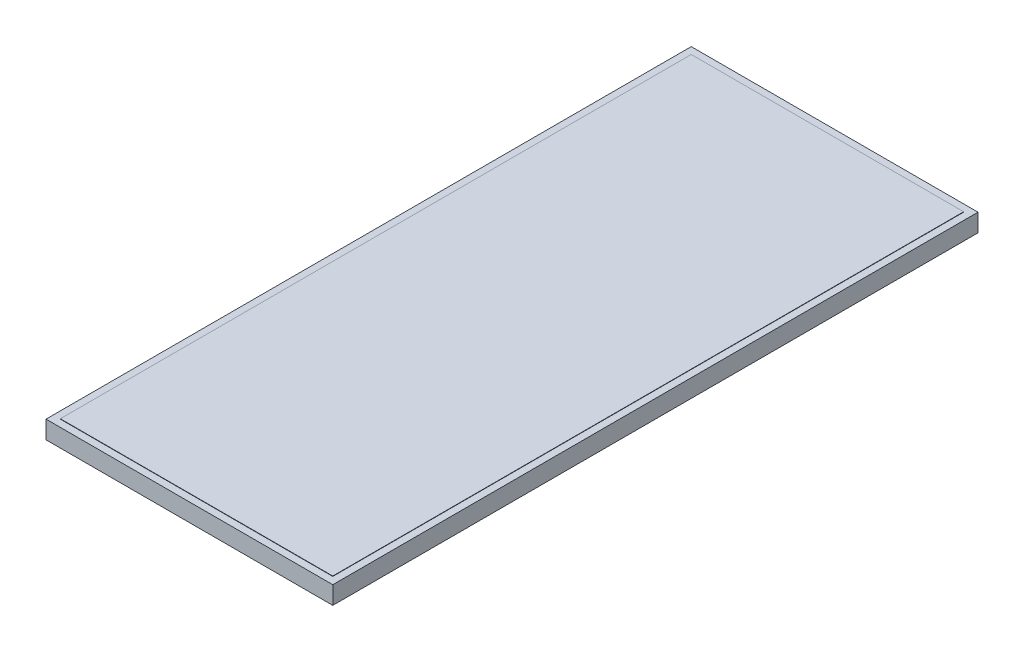
ISO-10303-21;
HEADER;
FILE_DESCRIPTION(('STEP AP214'),'2;1');
FILE_NAME('part.step','',(''),(''),'','','');
FILE_SCHEMA(('AUTOMOTIVE_DESIGN { 1 0 10303 214 1 1 1 1 }'));
ENDSEC;
DATA;
#1=APPLICATION_CONTEXT('core data for automotive mechanical design processes');
#2=APPLICATION_PROTOCOL_DEFINITION('international standard','automotive_design',2000,#1);
#3=PRODUCT_CONTEXT('',#1,'mechanical');
#4=PRODUCT('Part','Part','',(#3));
#5=PRODUCT_RELATED_PRODUCT_CATEGORY('part','',(#4));
#6=PRODUCT_DEFINITION_FORMATION('','',#4);
#7=PRODUCT_DEFINITION_CONTEXT('part definition',#1,'design');
#8=PRODUCT_DEFINITION('design','',#6,#7);
#9=PRODUCT_DEFINITION_SHAPE('','',#8);
#10=(LENGTH_UNIT() NAMED_UNIT(*) SI_UNIT(.MILLI.,.METRE.));
#11=(NAMED_UNIT(*) PLANE_ANGLE_UNIT() SI_UNIT($,.RADIAN.));
#12=(NAMED_UNIT(*) SI_UNIT($,.STERADIAN.) SOLID_ANGLE_UNIT());
#13=UNCERTAINTY_MEASURE_WITH_UNIT(LENGTH_MEASURE(1.E-05),#10,'distance_accuracy_value','');
#14=(GEOMETRIC_REPRESENTATION_CONTEXT(3) GLOBAL_UNCERTAINTY_ASSIGNED_CONTEXT((#13)) GLOBAL_UNIT_ASSIGNED_CONTEXT((#10,
#11,#12)) REPRESENTATION_CONTEXT('',''));
#15=CARTESIAN_POINT('',(0.,0.,0.));
#16=DIRECTION('',(0.,0.,1.));
#17=DIRECTION('',(1.,0.,0.));
#18=AXIS2_PLACEMENT_3D('',#15,#16,#17);
#19=CARTESIAN_POINT('',(0.,50.,0.));
#20=DIRECTION('',(0.,-1.,0.));
#21=DIRECTION('',(0.,0.,-1.));
#22=AXIS2_PLACEMENT_3D('',#19,#20,#21);
#23=PLANE('',#22);
#24=DIRECTION('',(0.,0.,1.));
#25=VECTOR('',#24,1.);
#26=CARTESIAN_POINT('',(0.,50.,0.));
#27=LINE('',#26,#25);
#28=CARTESIAN_POINT('',(0.,50.,-1800.));
#29=VERTEX_POINT('',#28);
#30=CARTESIAN_POINT('',(0.,50.,0.));
#31=VERTEX_POINT('',#30);
#32=EDGE_CURVE('E130',#29,#31,#27,.T.);
#33=ORIENTED_EDGE('',*,*,#32,.T.);
#34=DIRECTION('',(1.,0.,0.));
#35=VECTOR('',#34,1.);
#36=CARTESIAN_POINT('',(0.,50.,0.));
#37=LINE('',#36,#35);
#38=CARTESIAN_POINT('',(800.,50.,0.));
#39=VERTEX_POINT('',#38);
#40=EDGE_CURVE('E133',#31,#39,#37,.T.);
#41=ORIENTED_EDGE('',*,*,#40,.T.);
#42=DIRECTION('',(0.,0.,-1.));
#43=VECTOR('',#42,1.);
#44=CARTESIAN_POINT('',(800.,50.,0.));
#45=LINE('',#44,#43);
#46=CARTESIAN_POINT('',(800.,50.,-1800.));
#47=VERTEX_POINT('',#46);
#48=EDGE_CURVE('E136',#39,#47,#45,.T.);
#49=ORIENTED_EDGE('',*,*,#48,.T.);
#50=DIRECTION('',(-1.,0.,0.));
#51=VECTOR('',#50,1.);
#52=CARTESIAN_POINT('',(0.,50.,-1800.));
#53=LINE('',#52,#51);
#54=EDGE_CURVE('E138',#47,#29,#53,.T.);
#55=ORIENTED_EDGE('',*,*,#54,.T.);
#56=EDGE_LOOP('',(#33,#41,#49,#55));
#57=FACE_BOUND('',#56,.T.);
#58=DIRECTION('',(-1.,0.,0.));
#59=VECTOR('',#58,1.);
#60=CARTESIAN_POINT('',(780.,50.,-1780.));
#61=LINE('',#60,#59);
#62=CARTESIAN_POINT('',(780.,50.,-1780.));
#63=VERTEX_POINT('',#62);
#64=CARTESIAN_POINT('',(20.,50.,-1780.));
#65=VERTEX_POINT('',#64);
#66=EDGE_CURVE('E120',#63,#65,#61,.T.);
#67=ORIENTED_EDGE('',*,*,#66,.F.);
#68=DIRECTION('',(0.,0.,-1.));
#69=VECTOR('',#68,1.);
#70=CARTESIAN_POINT('',(780.,50.,-20.));
#71=LINE('',#70,#69);
#72=CARTESIAN_POINT('',(780.,50.,-20.));
#73=VERTEX_POINT('',#72);
#74=EDGE_CURVE('E117',#73,#63,#71,.T.);
#75=ORIENTED_EDGE('',*,*,#74,.F.);
#76=DIRECTION('',(1.,0.,0.));
#77=VECTOR('',#76,1.);
#78=CARTESIAN_POINT('',(20.,50.,-20.));
#79=LINE('',#78,#77);
#80=CARTESIAN_POINT('',(20.,50.,-20.));
#81=VERTEX_POINT('',#80);
#82=EDGE_CURVE('E55',#81,#73,#79,.T.);
#83=ORIENTED_EDGE('',*,*,#82,.F.);
#84=DIRECTION('',(0.,0.,1.));
#85=VECTOR('',#84,1.);
#86=CARTESIAN_POINT('',(20.,50.,-1780.));
#87=LINE('',#86,#85);
#88=EDGE_CURVE('E50',#65,#81,#87,.T.);
#89=ORIENTED_EDGE('',*,*,#88,.F.);
#90=EDGE_LOOP('',(#67,#75,#83,#89));
#91=FACE_BOUND('',#90,.T.);
#92=ADVANCED_FACE('F35',(#57,#91),#23,.F.);
#93=CARTESIAN_POINT('',(0.,50.,0.));
#94=DIRECTION('',(1.,0.,0.));
#95=DIRECTION('',(0.,0.,-1.));
#96=AXIS2_PLACEMENT_3D('',#93,#94,#95);
#97=PLANE('',#96);
#98=DIRECTION('',(0.,0.,1.));
#99=VECTOR('',#98,1.);
#100=CARTESIAN_POINT('',(0.,0.,0.));
#101=LINE('',#100,#99);
#102=CARTESIAN_POINT('',(0.,0.,-1800.));
#103=VERTEX_POINT('',#102);
#104=CARTESIAN_POINT('',(0.,0.,0.));
#105=VERTEX_POINT('',#104);
#106=EDGE_CURVE('E121',#103,#105,#101,.T.);
#107=ORIENTED_EDGE('',*,*,#106,.T.);
#108=DIRECTION('',(0.,-1.,0.));
#109=VECTOR('',#108,1.);
#110=CARTESIAN_POINT('',(0.,50.,0.));
#111=LINE('',#110,#109);
#112=EDGE_CURVE('E11',#31,#105,#111,.T.);
#113=ORIENTED_EDGE('',*,*,#112,.F.);
#114=ORIENTED_EDGE('',*,*,#32,.F.);
#115=DIRECTION('',(0.,-1.,0.));
#116=VECTOR('',#115,1.);
#117=CARTESIAN_POINT('',(0.,50.,-1800.));
#118=LINE('',#117,#116);
#119=EDGE_CURVE('E139',#29,#103,#118,.T.);
#120=ORIENTED_EDGE('',*,*,#119,.T.);
#121=EDGE_LOOP('',(#107,#113,#114,#120));
#122=FACE_BOUND('',#121,.T.);
#123=ADVANCED_FACE('F37',(#122),#97,.F.);
#124=CARTESIAN_POINT('',(0.,50.,0.));
#125=DIRECTION('',(0.,0.,-1.));
#126=DIRECTION('',(-1.,0.,0.));
#127=AXIS2_PLACEMENT_3D('',#124,#125,#126);
#128=PLANE('',#127);
#129=DIRECTION('',(1.,0.,0.));
#130=VECTOR('',#129,1.);
#131=CARTESIAN_POINT('',(0.,0.,0.));
#132=LINE('',#131,#130);
#133=CARTESIAN_POINT('',(800.,0.,0.));
#134=VERTEX_POINT('',#133);
#135=EDGE_CURVE('E124',#105,#134,#132,.T.);
#136=ORIENTED_EDGE('',*,*,#135,.T.);
#137=DIRECTION('',(0.,-1.,0.));
#138=VECTOR('',#137,1.);
#139=CARTESIAN_POINT('',(800.,50.,0.));
#140=LINE('',#139,#138);
#141=EDGE_CURVE('E43',#39,#134,#140,.T.);
#142=ORIENTED_EDGE('',*,*,#141,.F.);
#143=ORIENTED_EDGE('',*,*,#40,.F.);
#144=ORIENTED_EDGE('',*,*,#112,.T.);
#145=EDGE_LOOP('',(#136,#142,#143,#144));
#146=FACE_BOUND('',#145,.T.);
#147=ADVANCED_FACE('F169',(#146),#128,.F.);
#148=CARTESIAN_POINT('',(800.,50.,0.));
#149=DIRECTION('',(-1.,0.,0.));
#150=DIRECTION('',(0.,0.,1.));
#151=AXIS2_PLACEMENT_3D('',#148,#149,#150);
#152=PLANE('',#151);
#153=DIRECTION('',(0.,0.,-1.));
#154=VECTOR('',#153,1.);
#155=CARTESIAN_POINT('',(800.,0.,0.));
#156=LINE('',#155,#154);
#157=CARTESIAN_POINT('',(800.,0.,-1800.));
#158=VERTEX_POINT('',#157);
#159=EDGE_CURVE('E142',#134,#158,#156,.T.);
#160=ORIENTED_EDGE('',*,*,#159,.T.);
#161=DIRECTION('',(0.,-1.,0.));
#162=VECTOR('',#161,1.);
#163=CARTESIAN_POINT('',(800.,50.,-1800.));
#164=LINE('',#163,#162);
#165=EDGE_CURVE('E147',#47,#158,#164,.T.);
#166=ORIENTED_EDGE('',*,*,#165,.F.);
#167=ORIENTED_EDGE('',*,*,#48,.F.);
#168=ORIENTED_EDGE('',*,*,#141,.T.);
#169=EDGE_LOOP('',(#160,#166,#167,#168));
#170=FACE_BOUND('',#169,.T.);
#171=ADVANCED_FACE('F154',(#170),#152,.F.);
#172=CARTESIAN_POINT('',(0.,50.,-1800.));
#173=DIRECTION('',(0.,0.,1.));
#174=DIRECTION('',(1.,0.,0.));
#175=AXIS2_PLACEMENT_3D('',#172,#173,#174);
#176=PLANE('',#175);
#177=DIRECTION('',(-1.,0.,0.));
#178=VECTOR('',#177,1.);
#179=CARTESIAN_POINT('',(0.,0.,-1800.));
#180=LINE('',#179,#178);
#181=EDGE_CURVE('E134',#158,#103,#180,.T.);
#182=ORIENTED_EDGE('',*,*,#181,.T.);
#183=ORIENTED_EDGE('',*,*,#119,.F.);
#184=ORIENTED_EDGE('',*,*,#54,.F.);
#185=ORIENTED_EDGE('',*,*,#165,.T.);
#186=EDGE_LOOP('',(#182,#183,#184,#185));
#187=FACE_BOUND('',#186,.T.);
#188=ADVANCED_FACE('F163',(#187),#176,.F.);
#189=CARTESIAN_POINT('',(0.,0.,0.));
#190=DIRECTION('',(0.,-1.,0.));
#191=DIRECTION('',(0.,0.,-1.));
#192=AXIS2_PLACEMENT_3D('',#189,#190,#191);
#193=PLANE('',#192);
#194=ORIENTED_EDGE('',*,*,#106,.F.);
#195=ORIENTED_EDGE('',*,*,#181,.F.);
#196=ORIENTED_EDGE('',*,*,#159,.F.);
#197=ORIENTED_EDGE('',*,*,#135,.F.);
#198=EDGE_LOOP('',(#194,#195,#196,#197));
#199=FACE_BOUND('',#198,.T.);
#200=ADVANCED_FACE('F160',(#199),#193,.T.);
#201=CARTESIAN_POINT('',(780.,51.,-1780.));
#202=DIRECTION('',(0.,0.,1.));
#203=DIRECTION('',(1.,0.,0.));
#204=AXIS2_PLACEMENT_3D('',#201,#202,#203);
#205=PLANE('',#204);
#206=ORIENTED_EDGE('',*,*,#66,.T.);
#207=DIRECTION('',(0.,-1.,0.));
#208=VECTOR('',#207,1.);
#209=CARTESIAN_POINT('',(20.,51.,-1780.));
#210=LINE('',#209,#208);
#211=CARTESIAN_POINT('',(20.,51.,-1780.));
#212=VERTEX_POINT('',#211);
#213=EDGE_CURVE('E101',#212,#65,#210,.T.);
#214=ORIENTED_EDGE('',*,*,#213,.F.);
#215=DIRECTION('',(-1.,0.,0.));
#216=VECTOR('',#215,1.);
#217=CARTESIAN_POINT('',(780.,51.,-1780.));
#218=LINE('',#217,#216);
#219=CARTESIAN_POINT('',(780.,51.,-1780.));
#220=VERTEX_POINT('',#219);
#221=EDGE_CURVE('E108',#220,#212,#218,.T.);
#222=ORIENTED_EDGE('',*,*,#221,.F.);
#223=DIRECTION('',(0.,-1.,0.));
#224=VECTOR('',#223,1.);
#225=CARTESIAN_POINT('',(780.,51.,-1780.));
#226=LINE('',#225,#224);
#227=EDGE_CURVE('E254',#220,#63,#226,.T.);
#228=ORIENTED_EDGE('',*,*,#227,.T.);
#229=EDGE_LOOP('',(#206,#214,#222,#228));
#230=FACE_BOUND('',#229,.T.);
#231=ADVANCED_FACE('F119',(#230),#205,.F.);
#232=CARTESIAN_POINT('',(20.,51.,-1780.));
#233=DIRECTION('',(1.,0.,0.));
#234=DIRECTION('',(0.,0.,-1.));
#235=AXIS2_PLACEMENT_3D('',#232,#233,#234);
#236=PLANE('',#235);
#237=ORIENTED_EDGE('',*,*,#88,.T.);
#238=DIRECTION('',(0.,-1.,0.));
#239=VECTOR('',#238,1.);
#240=CARTESIAN_POINT('',(20.,51.,-20.));
#241=LINE('',#240,#239);
#242=CARTESIAN_POINT('',(20.,51.,-20.));
#243=VERTEX_POINT('',#242);
#244=EDGE_CURVE('E104',#243,#81,#241,.T.);
#245=ORIENTED_EDGE('',*,*,#244,.F.);
#246=DIRECTION('',(0.,0.,1.));
#247=VECTOR('',#246,1.);
#248=CARTESIAN_POINT('',(20.,51.,-1780.));
#249=LINE('',#248,#247);
#250=EDGE_CURVE('E97',#212,#243,#249,.T.);
#251=ORIENTED_EDGE('',*,*,#250,.F.);
#252=ORIENTED_EDGE('',*,*,#213,.T.);
#253=EDGE_LOOP('',(#237,#245,#251,#252));
#254=FACE_BOUND('',#253,.T.);
#255=ADVANCED_FACE('F99',(#254),#236,.F.);
#256=CARTESIAN_POINT('',(20.,51.,-20.));
#257=DIRECTION('',(0.,0.,-1.));
#258=DIRECTION('',(-1.,0.,0.));
#259=AXIS2_PLACEMENT_3D('',#256,#257,#258);
#260=PLANE('',#259);
#261=ORIENTED_EDGE('',*,*,#82,.T.);
#262=DIRECTION('',(0.,-1.,0.));
#263=VECTOR('',#262,1.);
#264=CARTESIAN_POINT('',(780.,51.,-20.));
#265=LINE('',#264,#263);
#266=CARTESIAN_POINT('',(780.,51.,-20.));
#267=VERTEX_POINT('',#266);
#268=EDGE_CURVE('E126',#267,#73,#265,.T.);
#269=ORIENTED_EDGE('',*,*,#268,.F.);
#270=DIRECTION('',(1.,0.,0.));
#271=VECTOR('',#270,1.);
#272=CARTESIAN_POINT('',(20.,51.,-20.));
#273=LINE('',#272,#271);
#274=EDGE_CURVE('E107',#243,#267,#273,.T.);
#275=ORIENTED_EDGE('',*,*,#274,.F.);
#276=ORIENTED_EDGE('',*,*,#244,.T.);
#277=EDGE_LOOP('',(#261,#269,#275,#276));
#278=FACE_BOUND('',#277,.T.);
#279=ADVANCED_FACE('F210',(#278),#260,.F.);
#280=CARTESIAN_POINT('',(780.,51.,-20.));
#281=DIRECTION('',(-1.,0.,0.));
#282=DIRECTION('',(0.,0.,1.));
#283=AXIS2_PLACEMENT_3D('',#280,#281,#282);
#284=PLANE('',#283);
#285=ORIENTED_EDGE('',*,*,#74,.T.);
#286=ORIENTED_EDGE('',*,*,#227,.F.);
#287=DIRECTION('',(0.,0.,-1.));
#288=VECTOR('',#287,1.);
#289=CARTESIAN_POINT('',(780.,51.,-20.));
#290=LINE('',#289,#288);
#291=EDGE_CURVE('E113',#267,#220,#290,.T.);
#292=ORIENTED_EDGE('',*,*,#291,.F.);
#293=ORIENTED_EDGE('',*,*,#268,.T.);
#294=EDGE_LOOP('',(#285,#286,#292,#293));
#295=FACE_BOUND('',#294,.T.);
#296=ADVANCED_FACE('F217',(#295),#284,.F.);
#297=CARTESIAN_POINT('',(0.,51.,0.));
#298=DIRECTION('',(0.,1.,0.));
#299=DIRECTION('',(0.,0.,1.));
#300=AXIS2_PLACEMENT_3D('',#297,#298,#299);
#301=PLANE('',#300);
#302=ORIENTED_EDGE('',*,*,#221,.T.);
#303=ORIENTED_EDGE('',*,*,#250,.T.);
#304=ORIENTED_EDGE('',*,*,#274,.T.);
#305=ORIENTED_EDGE('',*,*,#291,.T.);
#306=EDGE_LOOP('',(#302,#303,#304,#305));
#307=FACE_BOUND('',#306,.T.);
#308=ADVANCED_FACE('F111',(#307),#301,.T.);
#309=CLOSED_SHELL('',(#92,#123,#147,#171,#188,#200,#231,#255,#279,#296,#308));
#310=MANIFOLD_SOLID_BREP('B2',#309);
#311=ADVANCED_BREP_SHAPE_REPRESENTATION('',(#18,#310),#14);
#312=SHAPE_DEFINITION_REPRESENTATION(#9,#311);
ENDSEC;
END-ISO-10303-21;
